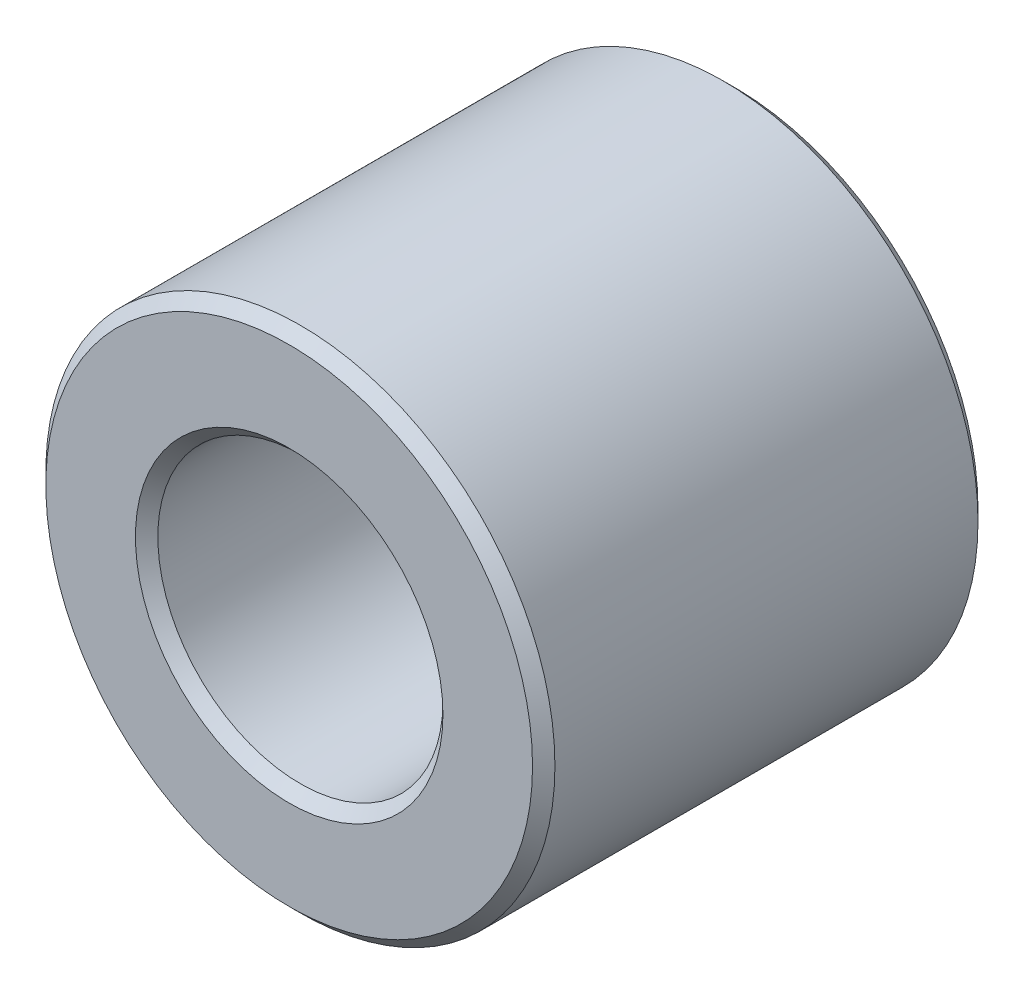
ISO-10303-21;
HEADER;
FILE_DESCRIPTION(('STEP AP214'),'2;1');
FILE_NAME('part.step','',(''),(''),'','','');
FILE_SCHEMA(('AUTOMOTIVE_DESIGN { 1 0 10303 214 1 1 1 1 }'));
ENDSEC;
DATA;
#1=APPLICATION_CONTEXT('core data for automotive mechanical design processes');
#2=APPLICATION_PROTOCOL_DEFINITION('international standard','automotive_design',2000,#1);
#3=PRODUCT_CONTEXT('',#1,'mechanical');
#4=PRODUCT('Part','Part','',(#3));
#5=PRODUCT_RELATED_PRODUCT_CATEGORY('part','',(#4));
#6=PRODUCT_DEFINITION_FORMATION('','',#4);
#7=PRODUCT_DEFINITION_CONTEXT('part definition',#1,'design');
#8=PRODUCT_DEFINITION('design','',#6,#7);
#9=PRODUCT_DEFINITION_SHAPE('','',#8);
#10=(LENGTH_UNIT() NAMED_UNIT(*) SI_UNIT(.MILLI.,.METRE.));
#11=(NAMED_UNIT(*) PLANE_ANGLE_UNIT() SI_UNIT($,.RADIAN.));
#12=(NAMED_UNIT(*) SI_UNIT($,.STERADIAN.) SOLID_ANGLE_UNIT());
#13=UNCERTAINTY_MEASURE_WITH_UNIT(LENGTH_MEASURE(1.E-05),#10,'distance_accuracy_value','');
#14=(GEOMETRIC_REPRESENTATION_CONTEXT(3) GLOBAL_UNCERTAINTY_ASSIGNED_CONTEXT((#13)) GLOBAL_UNIT_ASSIGNED_CONTEXT((#10,
#11,#12)) REPRESENTATION_CONTEXT('',''));
#15=CARTESIAN_POINT('',(0.,0.,0.));
#16=DIRECTION('',(0.,0.,1.));
#17=DIRECTION('',(1.,0.,0.));
#18=AXIS2_PLACEMENT_3D('',#15,#16,#17);
#19=CARTESIAN_POINT('',(0.,0.,-2.778125));
#20=DIRECTION('',(0.,0.,1.));
#21=DIRECTION('',(1.,0.,0.));
#22=AXIS2_PLACEMENT_3D('',#19,#20,#21);
#23=CYLINDRICAL_SURFACE('',#22,3.175);
#24=CARTESIAN_POINT('',(0.,0.,2.638425));
#25=DIRECTION('',(0.,0.,1.));
#26=DIRECTION('',(1.,0.,0.));
#27=AXIS2_PLACEMENT_3D('',#24,#25,#26);
#28=CIRCLE('',#27,3.175);
#29=CARTESIAN_POINT('',(3.175,0.,2.638425));
#30=VERTEX_POINT('',#29);
#31=EDGE_CURVE('E50',#30,#30,#28,.F.);
#32=ORIENTED_EDGE('',*,*,#31,.T.);
#33=EDGE_LOOP('',(#32));
#34=FACE_BOUND('',#33,.T.);
#35=CARTESIAN_POINT('',(0.,0.,-2.638425));
#36=DIRECTION('',(0.,0.,1.));
#37=DIRECTION('',(1.,0.,0.));
#38=AXIS2_PLACEMENT_3D('',#35,#36,#37);
#39=CIRCLE('',#38,3.175);
#40=CARTESIAN_POINT('',(3.175,0.,-2.638425));
#41=VERTEX_POINT('',#40);
#42=EDGE_CURVE('E53',#41,#41,#39,.T.);
#43=ORIENTED_EDGE('',*,*,#42,.T.);
#44=EDGE_LOOP('',(#43));
#45=FACE_BOUND('',#44,.T.);
#46=ADVANCED_FACE('F30',(#34,#45),#23,.T.);
#47=CARTESIAN_POINT('',(0.,0.,-2.778125));
#48=DIRECTION('',(0.,0.,1.));
#49=DIRECTION('',(1.,0.,0.));
#50=AXIS2_PLACEMENT_3D('',#47,#48,#49);
#51=PLANE('',#50);
#52=CARTESIAN_POINT('',(0.,0.,-2.778125));
#53=DIRECTION('',(0.,0.,1.));
#54=DIRECTION('',(1.,0.,0.));
#55=AXIS2_PLACEMENT_3D('',#52,#53,#54);
#56=CIRCLE('',#55,3.0353);
#57=CARTESIAN_POINT('',(3.0353,0.,-2.778125));
#58=VERTEX_POINT('',#57);
#59=EDGE_CURVE('E41',#58,#58,#56,.F.);
#60=ORIENTED_EDGE('',*,*,#59,.T.);
#61=EDGE_LOOP('',(#60));
#62=FACE_BOUND('',#61,.T.);
#63=CARTESIAN_POINT('',(0.,0.,-2.778125));
#64=DIRECTION('',(0.,0.,1.));
#65=DIRECTION('',(1.,0.,0.));
#66=AXIS2_PLACEMENT_3D('',#63,#64,#65);
#67=CIRCLE('',#66,1.9177);
#68=CARTESIAN_POINT('',(1.9177,0.,-2.778125));
#69=VERTEX_POINT('',#68);
#70=EDGE_CURVE('E45',#69,#69,#67,.T.);
#71=ORIENTED_EDGE('',*,*,#70,.T.);
#72=EDGE_LOOP('',(#71));
#73=FACE_BOUND('',#72,.T.);
#74=ADVANCED_FACE('F78',(#62,#73),#51,.F.);
#75=CARTESIAN_POINT('',(0.,0.,-2.778125));
#76=DIRECTION('',(0.,0.,1.));
#77=DIRECTION('',(1.,0.,0.));
#78=AXIS2_PLACEMENT_3D('',#75,#76,#77);
#79=CYLINDRICAL_SURFACE('',#78,1.778);
#80=CARTESIAN_POINT('',(0.,0.,2.638425));
#81=DIRECTION('',(0.,0.,1.));
#82=DIRECTION('',(1.,0.,0.));
#83=AXIS2_PLACEMENT_3D('',#80,#81,#82);
#84=CIRCLE('',#83,1.778);
#85=CARTESIAN_POINT('',(1.778,0.,2.638425));
#86=VERTEX_POINT('',#85);
#87=EDGE_CURVE('E10',#86,#86,#84,.T.);
#88=ORIENTED_EDGE('',*,*,#87,.T.);
#89=EDGE_LOOP('',(#88));
#90=FACE_BOUND('',#89,.T.);
#91=CARTESIAN_POINT('',(0.,0.,-2.638425));
#92=DIRECTION('',(0.,0.,1.));
#93=DIRECTION('',(1.,0.,0.));
#94=AXIS2_PLACEMENT_3D('',#91,#92,#93);
#95=CIRCLE('',#94,1.778);
#96=CARTESIAN_POINT('',(1.778,0.,-2.638425));
#97=VERTEX_POINT('',#96);
#98=EDGE_CURVE('E37',#97,#97,#95,.F.);
#99=ORIENTED_EDGE('',*,*,#98,.T.);
#100=EDGE_LOOP('',(#99));
#101=FACE_BOUND('',#100,.T.);
#102=ADVANCED_FACE('F84',(#90,#101),#79,.F.);
#103=CARTESIAN_POINT('',(0.,0.,2.778125));
#104=DIRECTION('',(0.,0.,1.));
#105=DIRECTION('',(1.,0.,0.));
#106=AXIS2_PLACEMENT_3D('',#103,#104,#105);
#107=PLANE('',#106);
#108=CARTESIAN_POINT('',(0.,0.,2.778125));
#109=DIRECTION('',(0.,0.,1.));
#110=DIRECTION('',(1.,0.,0.));
#111=AXIS2_PLACEMENT_3D('',#108,#109,#110);
#112=CIRCLE('',#111,3.0353);
#113=CARTESIAN_POINT('',(3.0353,0.,2.778125));
#114=VERTEX_POINT('',#113);
#115=EDGE_CURVE('E56',#114,#114,#112,.T.);
#116=ORIENTED_EDGE('',*,*,#115,.T.);
#117=EDGE_LOOP('',(#116));
#118=FACE_BOUND('',#117,.T.);
#119=CARTESIAN_POINT('',(0.,0.,2.778125));
#120=DIRECTION('',(0.,0.,1.));
#121=DIRECTION('',(1.,0.,0.));
#122=AXIS2_PLACEMENT_3D('',#119,#120,#121);
#123=CIRCLE('',#122,1.9177);
#124=CARTESIAN_POINT('',(1.9177,0.,2.778125));
#125=VERTEX_POINT('',#124);
#126=EDGE_CURVE('E59',#125,#125,#123,.F.);
#127=ORIENTED_EDGE('',*,*,#126,.T.);
#128=EDGE_LOOP('',(#127));
#129=FACE_BOUND('',#128,.T.);
#130=ADVANCED_FACE('F63',(#118,#129),#107,.T.);
#131=CARTESIAN_POINT('',(0.,0.,2.778125));
#132=DIRECTION('',(0.,0.,-1.));
#133=DIRECTION('',(-1.,0.,0.));
#134=AXIS2_PLACEMENT_3D('',#131,#132,#133);
#135=CONICAL_SURFACE('',#134,3.0353,0.785398163397451);
#136=ORIENTED_EDGE('',*,*,#31,.F.);
#137=EDGE_LOOP('',(#136));
#138=FACE_BOUND('',#137,.T.);
#139=ORIENTED_EDGE('',*,*,#115,.F.);
#140=EDGE_LOOP('',(#139));
#141=FACE_BOUND('',#140,.T.);
#142=ADVANCED_FACE('F74',(#138,#141),#135,.T.);
#143=CARTESIAN_POINT('',(0.,0.,-2.638425));
#144=DIRECTION('',(0.,0.,1.));
#145=DIRECTION('',(1.,0.,0.));
#146=AXIS2_PLACEMENT_3D('',#143,#144,#145);
#147=CONICAL_SURFACE('',#146,3.175,0.785398163397453);
#148=ORIENTED_EDGE('',*,*,#59,.F.);
#149=EDGE_LOOP('',(#148));
#150=FACE_BOUND('',#149,.T.);
#151=ORIENTED_EDGE('',*,*,#42,.F.);
#152=EDGE_LOOP('',(#151));
#153=FACE_BOUND('',#152,.T.);
#154=ADVANCED_FACE('F68',(#150,#153),#147,.T.);
#155=CARTESIAN_POINT('',(0.,0.,2.638425));
#156=DIRECTION('',(0.,0.,1.));
#157=DIRECTION('',(1.,0.,0.));
#158=AXIS2_PLACEMENT_3D('',#155,#156,#157);
#159=CONICAL_SURFACE('',#158,1.778,0.785398163397448);
#160=ORIENTED_EDGE('',*,*,#126,.F.);
#161=EDGE_LOOP('',(#160));
#162=FACE_BOUND('',#161,.T.);
#163=ORIENTED_EDGE('',*,*,#87,.F.);
#164=EDGE_LOOP('',(#163));
#165=FACE_BOUND('',#164,.T.);
#166=ADVANCED_FACE('F65',(#162,#165),#159,.F.);
#167=CARTESIAN_POINT('',(0.,0.,-2.778125));
#168=DIRECTION('',(0.,0.,-1.));
#169=DIRECTION('',(-1.,0.,0.));
#170=AXIS2_PLACEMENT_3D('',#167,#168,#169);
#171=CONICAL_SURFACE('',#170,1.9177,0.785398163397445);
#172=ORIENTED_EDGE('',*,*,#98,.F.);
#173=EDGE_LOOP('',(#172));
#174=FACE_BOUND('',#173,.T.);
#175=ORIENTED_EDGE('',*,*,#70,.F.);
#176=EDGE_LOOP('',(#175));
#177=FACE_BOUND('',#176,.T.);
#178=ADVANCED_FACE('F32',(#174,#177),#171,.F.);
#179=CLOSED_SHELL('',(#46,#74,#102,#130,#142,#154,#166,#178));
#180=MANIFOLD_SOLID_BREP('B2',#179);
#181=ADVANCED_BREP_SHAPE_REPRESENTATION('',(#18,#180),#14);
#182=SHAPE_DEFINITION_REPRESENTATION(#9,#181);
ENDSEC;
END-ISO-10303-21;
